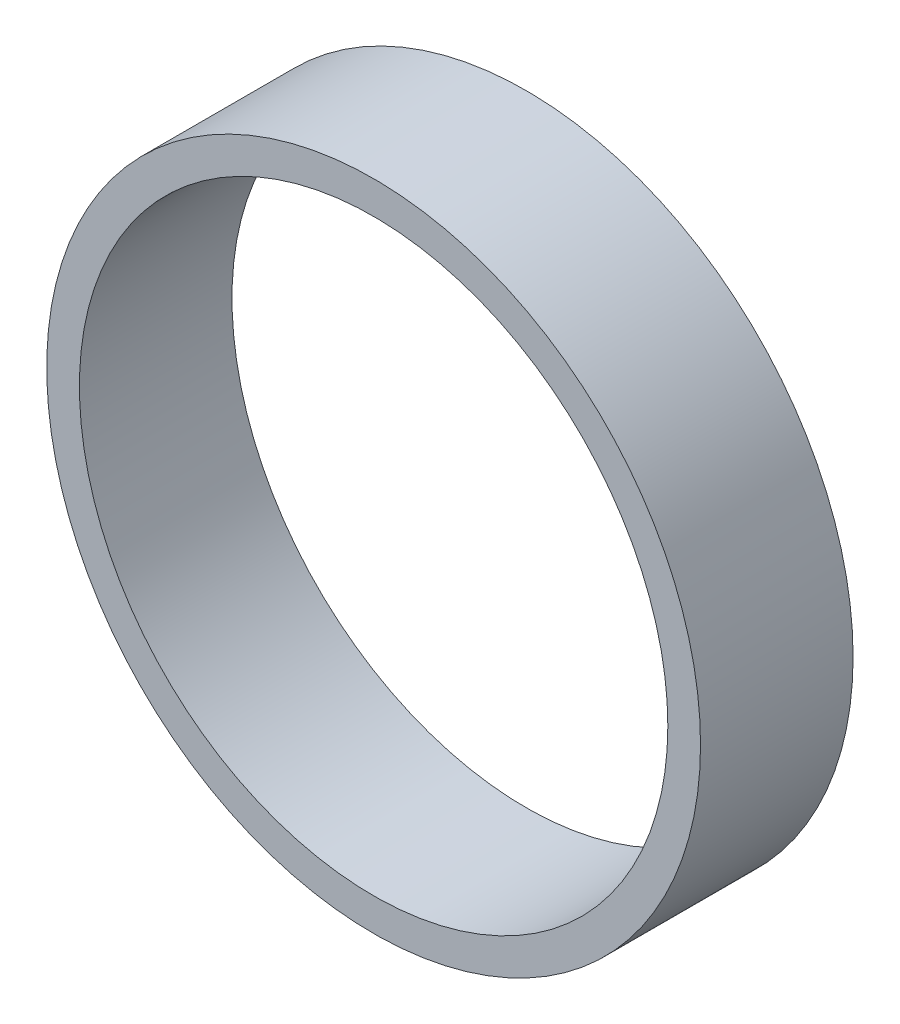
ISO-10303-21;
HEADER;
FILE_DESCRIPTION(('STEP AP214'),'2;1');
FILE_NAME('part.step','',(''),(''),'','','');
FILE_SCHEMA(('AUTOMOTIVE_DESIGN { 1 0 10303 214 1 1 1 1 }'));
ENDSEC;
DATA;
#1=APPLICATION_CONTEXT('core data for automotive mechanical design processes');
#2=APPLICATION_PROTOCOL_DEFINITION('international standard','automotive_design',2000,#1);
#3=PRODUCT_CONTEXT('',#1,'mechanical');
#4=PRODUCT('Part','Part','',(#3));
#5=PRODUCT_RELATED_PRODUCT_CATEGORY('part','',(#4));
#6=PRODUCT_DEFINITION_FORMATION('','',#4);
#7=PRODUCT_DEFINITION_CONTEXT('part definition',#1,'design');
#8=PRODUCT_DEFINITION('design','',#6,#7);
#9=PRODUCT_DEFINITION_SHAPE('','',#8);
#10=(LENGTH_UNIT() NAMED_UNIT(*) SI_UNIT(.MILLI.,.METRE.));
#11=(NAMED_UNIT(*) PLANE_ANGLE_UNIT() SI_UNIT($,.RADIAN.));
#12=(NAMED_UNIT(*) SI_UNIT($,.STERADIAN.) SOLID_ANGLE_UNIT());
#13=UNCERTAINTY_MEASURE_WITH_UNIT(LENGTH_MEASURE(1.E-05),#10,'distance_accuracy_value','');
#14=(GEOMETRIC_REPRESENTATION_CONTEXT(3) GLOBAL_UNCERTAINTY_ASSIGNED_CONTEXT((#13)) GLOBAL_UNIT_ASSIGNED_CONTEXT((#10,
#11,#12)) REPRESENTATION_CONTEXT('',''));
#15=CARTESIAN_POINT('',(0.,0.,0.));
#16=DIRECTION('',(0.,0.,1.));
#17=DIRECTION('',(1.,0.,0.));
#18=AXIS2_PLACEMENT_3D('',#15,#16,#17);
#19=CARTESIAN_POINT('',(0.,0.,7.));
#20=DIRECTION('',(0.,0.,1.));
#21=DIRECTION('',(1.,0.,0.));
#22=AXIS2_PLACEMENT_3D('',#19,#20,#21);
#23=PLANE('',#22);
#24=CARTESIAN_POINT('',(0.,0.,7.));
#25=DIRECTION('',(0.,0.,1.));
#26=DIRECTION('',(1.,0.,0.));
#27=AXIS2_PLACEMENT_3D('',#24,#25,#26);
#28=CIRCLE('',#27,15.);
#29=CARTESIAN_POINT('',(15.,0.,7.));
#30=VERTEX_POINT('',#29);
#31=EDGE_CURVE('E10',#30,#30,#28,.T.);
#32=ORIENTED_EDGE('',*,*,#31,.T.);
#33=EDGE_LOOP('',(#32));
#34=FACE_BOUND('',#33,.T.);
#35=CARTESIAN_POINT('',(0.,0.,7.));
#36=DIRECTION('',(0.,0.,1.));
#37=DIRECTION('',(1.,0.,0.));
#38=AXIS2_PLACEMENT_3D('',#35,#36,#37);
#39=CIRCLE('',#38,13.5);
#40=CARTESIAN_POINT('',(13.5,0.,7.));
#41=VERTEX_POINT('',#40);
#42=EDGE_CURVE('E43',#41,#41,#39,.T.);
#43=ORIENTED_EDGE('',*,*,#42,.F.);
#44=EDGE_LOOP('',(#43));
#45=FACE_BOUND('',#44,.T.);
#46=ADVANCED_FACE('F32',(#34,#45),#23,.T.);
#47=CARTESIAN_POINT('',(0.,0.,0.));
#48=DIRECTION('',(0.,0.,1.));
#49=DIRECTION('',(1.,0.,0.));
#50=AXIS2_PLACEMENT_3D('',#47,#48,#49);
#51=PLANE('',#50);
#52=CARTESIAN_POINT('',(0.,0.,0.));
#53=DIRECTION('',(0.,0.,1.));
#54=DIRECTION('',(1.,0.,0.));
#55=AXIS2_PLACEMENT_3D('',#52,#53,#54);
#56=CIRCLE('',#55,15.);
#57=CARTESIAN_POINT('',(15.,0.,0.));
#58=VERTEX_POINT('',#57);
#59=EDGE_CURVE('E36',#58,#58,#56,.T.);
#60=ORIENTED_EDGE('',*,*,#59,.F.);
#61=EDGE_LOOP('',(#60));
#62=FACE_BOUND('',#61,.T.);
#63=CARTESIAN_POINT('',(0.,0.,0.));
#64=DIRECTION('',(0.,0.,1.));
#65=DIRECTION('',(1.,0.,0.));
#66=AXIS2_PLACEMENT_3D('',#63,#64,#65);
#67=CIRCLE('',#66,13.5);
#68=CARTESIAN_POINT('',(13.5,0.,0.));
#69=VERTEX_POINT('',#68);
#70=EDGE_CURVE('E45',#69,#69,#67,.T.);
#71=ORIENTED_EDGE('',*,*,#70,.T.);
#72=EDGE_LOOP('',(#71));
#73=FACE_BOUND('',#72,.T.);
#74=ADVANCED_FACE('F55',(#62,#73),#51,.F.);
#75=CARTESIAN_POINT('',(0.,0.,7.));
#76=DIRECTION('',(0.,0.,-1.));
#77=DIRECTION('',(-1.,0.,0.));
#78=AXIS2_PLACEMENT_3D('',#75,#76,#77);
#79=CYLINDRICAL_SURFACE('',#78,15.);
#80=ORIENTED_EDGE('',*,*,#31,.F.);
#81=EDGE_LOOP('',(#80));
#82=FACE_BOUND('',#81,.T.);
#83=ORIENTED_EDGE('',*,*,#59,.T.);
#84=EDGE_LOOP('',(#83));
#85=FACE_BOUND('',#84,.T.);
#86=ADVANCED_FACE('F34',(#82,#85),#79,.T.);
#87=CARTESIAN_POINT('',(0.,0.,7.));
#88=DIRECTION('',(0.,0.,-1.));
#89=DIRECTION('',(-1.,0.,0.));
#90=AXIS2_PLACEMENT_3D('',#87,#88,#89);
#91=CYLINDRICAL_SURFACE('',#90,13.5);
#92=ORIENTED_EDGE('',*,*,#42,.T.);
#93=EDGE_LOOP('',(#92));
#94=FACE_BOUND('',#93,.T.);
#95=ORIENTED_EDGE('',*,*,#70,.F.);
#96=EDGE_LOOP('',(#95));
#97=FACE_BOUND('',#96,.T.);
#98=ADVANCED_FACE('F51',(#94,#97),#91,.F.);
#99=CLOSED_SHELL('',(#46,#74,#86,#98));
#100=MANIFOLD_SOLID_BREP('B2',#99);
#101=ADVANCED_BREP_SHAPE_REPRESENTATION('',(#18,#100),#14);
#102=SHAPE_DEFINITION_REPRESENTATION(#9,#101);
ENDSEC;
END-ISO-10303-21;
